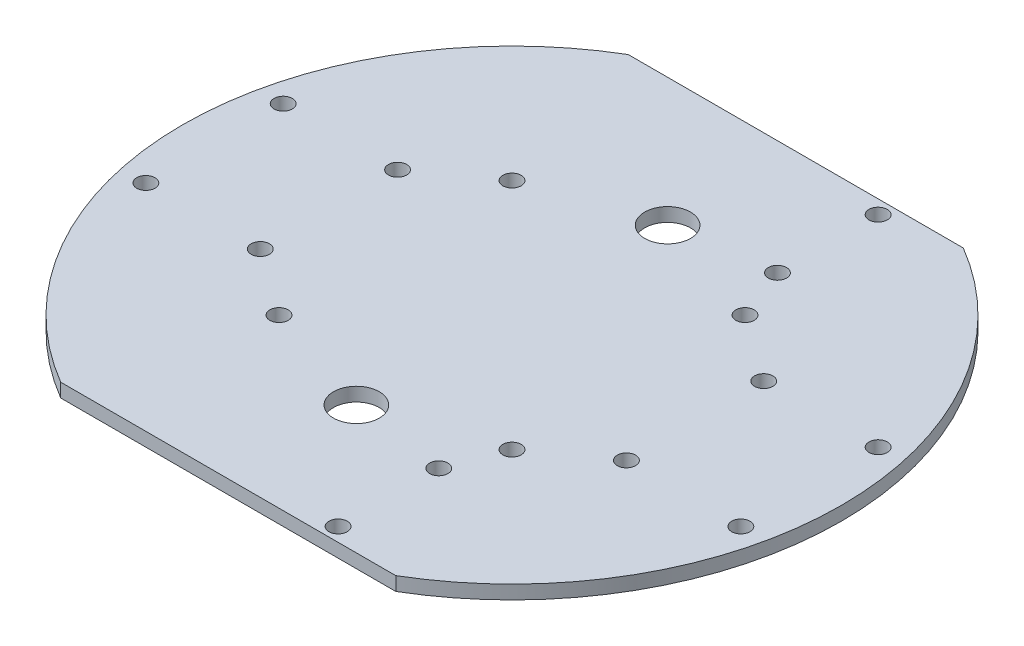
ISO-10303-21;
HEADER;
FILE_DESCRIPTION(('STEP AP214'),'2;1');
FILE_NAME('part.step','',(''),(''),'','','');
FILE_SCHEMA(('AUTOMOTIVE_DESIGN { 1 0 10303 214 1 1 1 1 }'));
ENDSEC;
DATA;
#1=APPLICATION_CONTEXT('core data for automotive mechanical design processes');
#2=APPLICATION_PROTOCOL_DEFINITION('international standard','automotive_design',2000,#1);
#3=PRODUCT_CONTEXT('',#1,'mechanical');
#4=PRODUCT('Part','Part','',(#3));
#5=PRODUCT_RELATED_PRODUCT_CATEGORY('part','',(#4));
#6=PRODUCT_DEFINITION_FORMATION('','',#4);
#7=PRODUCT_DEFINITION_CONTEXT('part definition',#1,'design');
#8=PRODUCT_DEFINITION('design','',#6,#7);
#9=PRODUCT_DEFINITION_SHAPE('','',#8);
#10=(LENGTH_UNIT() NAMED_UNIT(*) SI_UNIT(.MILLI.,.METRE.));
#11=(NAMED_UNIT(*) PLANE_ANGLE_UNIT() SI_UNIT($,.RADIAN.));
#12=(NAMED_UNIT(*) SI_UNIT($,.STERADIAN.) SOLID_ANGLE_UNIT());
#13=UNCERTAINTY_MEASURE_WITH_UNIT(LENGTH_MEASURE(1.E-05),#10,'distance_accuracy_value','');
#14=(GEOMETRIC_REPRESENTATION_CONTEXT(3) GLOBAL_UNCERTAINTY_ASSIGNED_CONTEXT((#13)) GLOBAL_UNIT_ASSIGNED_CONTEXT((#10,
#11,#12)) REPRESENTATION_CONTEXT('',''));
#15=CARTESIAN_POINT('',(0.,0.,0.));
#16=DIRECTION('',(0.,0.,1.));
#17=DIRECTION('',(1.,0.,0.));
#18=AXIS2_PLACEMENT_3D('',#15,#16,#17);
#19=CARTESIAN_POINT('',(0.,3.,0.));
#20=DIRECTION('',(0.,-1.,0.));
#21=DIRECTION('',(0.,0.,-1.));
#22=AXIS2_PLACEMENT_3D('',#19,#20,#21);
#23=CYLINDRICAL_SURFACE('',#22,72.);
#24=CARTESIAN_POINT('',(0.,0.,0.));
#25=DIRECTION('',(0.,1.,0.));
#26=DIRECTION('',(0.,0.,1.));
#27=AXIS2_PLACEMENT_3D('',#24,#25,#26);
#28=CIRCLE('',#27,72.);
#29=CARTESIAN_POINT('',(36.6060104354463,0.,62.));
#30=VERTEX_POINT('',#29);
#31=CARTESIAN_POINT('',(36.6060104354463,0.,-62.));
#32=VERTEX_POINT('',#31);
#33=EDGE_CURVE('E157',#30,#32,#28,.T.);
#34=ORIENTED_EDGE('',*,*,#33,.T.);
#35=DIRECTION('',(0.,-1.,0.));
#36=VECTOR('',#35,1.);
#37=CARTESIAN_POINT('',(36.6060104354463,3.,-62.));
#38=LINE('',#37,#36);
#39=CARTESIAN_POINT('',(36.6060104354463,3.,-62.));
#40=VERTEX_POINT('',#39);
#41=EDGE_CURVE('E11',#40,#32,#38,.T.);
#42=ORIENTED_EDGE('',*,*,#41,.F.);
#43=CARTESIAN_POINT('',(0.,3.,0.));
#44=DIRECTION('',(0.,1.,0.));
#45=DIRECTION('',(0.,0.,1.));
#46=AXIS2_PLACEMENT_3D('',#43,#44,#45);
#47=CIRCLE('',#46,72.);
#48=CARTESIAN_POINT('',(36.6060104354463,3.,62.));
#49=VERTEX_POINT('',#48);
#50=EDGE_CURVE('E79',#49,#40,#47,.T.);
#51=ORIENTED_EDGE('',*,*,#50,.F.);
#52=DIRECTION('',(0.,-1.,0.));
#53=VECTOR('',#52,1.);
#54=CARTESIAN_POINT('',(36.6060104354463,3.,62.));
#55=LINE('',#54,#53);
#56=EDGE_CURVE('E150',#49,#30,#55,.T.);
#57=ORIENTED_EDGE('',*,*,#56,.T.);
#58=EDGE_LOOP('',(#34,#42,#51,#57));
#59=FACE_BOUND('',#58,.T.);
#60=ADVANCED_FACE('F36',(#59),#23,.T.);
#61=CARTESIAN_POINT('',(0.,3.,-62.));
#62=DIRECTION('',(0.,0.,-1.));
#63=DIRECTION('',(-1.,0.,0.));
#64=AXIS2_PLACEMENT_3D('',#61,#62,#63);
#65=PLANE('',#64);
#66=DIRECTION('',(1.,0.,0.));
#67=VECTOR('',#66,1.);
#68=CARTESIAN_POINT('',(0.,0.,-62.));
#69=LINE('',#68,#67);
#70=CARTESIAN_POINT('',(-36.6060104354462,0.,-62.));
#71=VERTEX_POINT('',#70);
#72=EDGE_CURVE('E89',#71,#32,#69,.T.);
#73=ORIENTED_EDGE('',*,*,#72,.F.);
#74=DIRECTION('',(0.,-1.,0.));
#75=VECTOR('',#74,1.);
#76=CARTESIAN_POINT('',(-36.6060104354462,3.,-62.));
#77=LINE('',#76,#75);
#78=CARTESIAN_POINT('',(-36.6060104354462,3.,-62.));
#79=VERTEX_POINT('',#78);
#80=EDGE_CURVE('E45',#79,#71,#77,.T.);
#81=ORIENTED_EDGE('',*,*,#80,.F.);
#82=DIRECTION('',(1.,0.,0.));
#83=VECTOR('',#82,1.);
#84=CARTESIAN_POINT('',(0.,3.,-62.));
#85=LINE('',#84,#83);
#86=EDGE_CURVE('E87',#79,#40,#85,.T.);
#87=ORIENTED_EDGE('',*,*,#86,.T.);
#88=ORIENTED_EDGE('',*,*,#41,.T.);
#89=EDGE_LOOP('',(#73,#81,#87,#88));
#90=FACE_BOUND('',#89,.T.);
#91=ADVANCED_FACE('F86',(#90),#65,.T.);
#92=CARTESIAN_POINT('',(0.,3.,0.));
#93=DIRECTION('',(0.,-1.,0.));
#94=DIRECTION('',(0.,0.,-1.));
#95=AXIS2_PLACEMENT_3D('',#92,#93,#94);
#96=CYLINDRICAL_SURFACE('',#95,72.);
#97=CARTESIAN_POINT('',(0.,0.,0.));
#98=DIRECTION('',(0.,1.,0.));
#99=DIRECTION('',(0.,0.,1.));
#100=AXIS2_PLACEMENT_3D('',#97,#98,#99);
#101=CIRCLE('',#100,72.);
#102=CARTESIAN_POINT('',(-36.6060104354462,0.,62.));
#103=VERTEX_POINT('',#102);
#104=EDGE_CURVE('E68',#71,#103,#101,.T.);
#105=ORIENTED_EDGE('',*,*,#104,.T.);
#106=DIRECTION('',(0.,-1.,0.));
#107=VECTOR('',#106,1.);
#108=CARTESIAN_POINT('',(-36.6060104354462,3.,62.));
#109=LINE('',#108,#107);
#110=CARTESIAN_POINT('',(-36.6060104354462,3.,62.));
#111=VERTEX_POINT('',#110);
#112=EDGE_CURVE('E90',#111,#103,#109,.T.);
#113=ORIENTED_EDGE('',*,*,#112,.F.);
#114=CARTESIAN_POINT('',(0.,3.,0.));
#115=DIRECTION('',(0.,1.,0.));
#116=DIRECTION('',(0.,0.,1.));
#117=AXIS2_PLACEMENT_3D('',#114,#115,#116);
#118=CIRCLE('',#117,72.);
#119=EDGE_CURVE('E91',#79,#111,#118,.T.);
#120=ORIENTED_EDGE('',*,*,#119,.F.);
#121=ORIENTED_EDGE('',*,*,#80,.T.);
#122=EDGE_LOOP('',(#105,#113,#120,#121));
#123=FACE_BOUND('',#122,.T.);
#124=ADVANCED_FACE('F92',(#123),#96,.T.);
#125=CARTESIAN_POINT('',(40.,3.,15.));
#126=DIRECTION('',(0.,-1.,0.));
#127=DIRECTION('',(0.,0.,-1.));
#128=AXIS2_PLACEMENT_3D('',#125,#126,#127);
#129=CYLINDRICAL_SURFACE('',#128,2.);
#130=CARTESIAN_POINT('',(40.,3.,15.));
#131=DIRECTION('',(0.,1.,0.));
#132=DIRECTION('',(0.,0.,1.));
#133=AXIS2_PLACEMENT_3D('',#130,#131,#132);
#134=CIRCLE('',#133,2.);
#135=CARTESIAN_POINT('',(40.,3.,17.));
#136=VERTEX_POINT('',#135);
#137=EDGE_CURVE('E144',#136,#136,#134,.T.);
#138=ORIENTED_EDGE('',*,*,#137,.T.);
#139=EDGE_LOOP('',(#138));
#140=FACE_BOUND('',#139,.T.);
#141=CARTESIAN_POINT('',(40.,0.,15.));
#142=DIRECTION('',(0.,1.,0.));
#143=DIRECTION('',(0.,0.,1.));
#144=AXIS2_PLACEMENT_3D('',#141,#142,#143);
#145=CIRCLE('',#144,2.);
#146=CARTESIAN_POINT('',(40.,0.,17.));
#147=VERTEX_POINT('',#146);
#148=EDGE_CURVE('E205',#147,#147,#145,.T.);
#149=ORIENTED_EDGE('',*,*,#148,.F.);
#150=EDGE_LOOP('',(#149));
#151=FACE_BOUND('',#150,.T.);
#152=ADVANCED_FACE('F255',(#140,#151),#129,.F.);
#153=CARTESIAN_POINT('',(65.,3.,15.));
#154=DIRECTION('',(0.,-1.,0.));
#155=DIRECTION('',(0.,0.,-1.));
#156=AXIS2_PLACEMENT_3D('',#153,#154,#155);
#157=CYLINDRICAL_SURFACE('',#156,2.);
#158=CARTESIAN_POINT('',(65.,3.,15.));
#159=DIRECTION('',(0.,1.,0.));
#160=DIRECTION('',(0.,0.,1.));
#161=AXIS2_PLACEMENT_3D('',#158,#159,#160);
#162=CIRCLE('',#161,2.);
#163=CARTESIAN_POINT('',(65.,3.,17.));
#164=VERTEX_POINT('',#163);
#165=EDGE_CURVE('E141',#164,#164,#162,.T.);
#166=ORIENTED_EDGE('',*,*,#165,.T.);
#167=EDGE_LOOP('',(#166));
#168=FACE_BOUND('',#167,.T.);
#169=CARTESIAN_POINT('',(65.,0.,15.));
#170=DIRECTION('',(0.,1.,0.));
#171=DIRECTION('',(0.,0.,1.));
#172=AXIS2_PLACEMENT_3D('',#169,#170,#171);
#173=CIRCLE('',#172,2.);
#174=CARTESIAN_POINT('',(65.,0.,17.));
#175=VERTEX_POINT('',#174);
#176=EDGE_CURVE('E202',#175,#175,#173,.T.);
#177=ORIENTED_EDGE('',*,*,#176,.F.);
#178=EDGE_LOOP('',(#177));
#179=FACE_BOUND('',#178,.T.);
#180=ADVANCED_FACE('F258',(#168,#179),#157,.F.);
#181=CARTESIAN_POINT('',(65.,3.,-15.));
#182=DIRECTION('',(0.,-1.,0.));
#183=DIRECTION('',(0.,0.,-1.));
#184=AXIS2_PLACEMENT_3D('',#181,#182,#183);
#185=CYLINDRICAL_SURFACE('',#184,2.);
#186=CARTESIAN_POINT('',(65.,3.,-15.));
#187=DIRECTION('',(0.,1.,0.));
#188=DIRECTION('',(0.,0.,1.));
#189=AXIS2_PLACEMENT_3D('',#186,#187,#188);
#190=CIRCLE('',#189,2.);
#191=CARTESIAN_POINT('',(65.,3.,-13.));
#192=VERTEX_POINT('',#191);
#193=EDGE_CURVE('E138',#192,#192,#190,.F.);
#194=ORIENTED_EDGE('',*,*,#193,.F.);
#195=EDGE_LOOP('',(#194));
#196=FACE_BOUND('',#195,.T.);
#197=CARTESIAN_POINT('',(65.,0.,-15.));
#198=DIRECTION('',(0.,1.,0.));
#199=DIRECTION('',(0.,0.,1.));
#200=AXIS2_PLACEMENT_3D('',#197,#198,#199);
#201=CIRCLE('',#200,2.);
#202=CARTESIAN_POINT('',(65.,0.,-13.));
#203=VERTEX_POINT('',#202);
#204=EDGE_CURVE('E199',#203,#203,#201,.F.);
#205=ORIENTED_EDGE('',*,*,#204,.T.);
#206=EDGE_LOOP('',(#205));
#207=FACE_BOUND('',#206,.T.);
#208=ADVANCED_FACE('F262',(#196,#207),#185,.F.);
#209=CARTESIAN_POINT('',(25.4558441227157,3.,-25.4558441227157));
#210=DIRECTION('',(0.,-1.,0.));
#211=DIRECTION('',(0.,0.,-1.));
#212=AXIS2_PLACEMENT_3D('',#209,#210,#211);
#213=CYLINDRICAL_SURFACE('',#212,2.00000000000001);
#214=CARTESIAN_POINT('',(25.4558441227157,3.,-25.4558441227157));
#215=DIRECTION('',(0.,1.,0.));
#216=DIRECTION('',(0.,0.,1.));
#217=AXIS2_PLACEMENT_3D('',#214,#215,#216);
#218=CIRCLE('',#217,2.00000000000001);
#219=CARTESIAN_POINT('',(25.4558441227157,3.,-23.4558441227157));
#220=VERTEX_POINT('',#219);
#221=EDGE_CURVE('E135',#220,#220,#218,.T.);
#222=ORIENTED_EDGE('',*,*,#221,.T.);
#223=EDGE_LOOP('',(#222));
#224=FACE_BOUND('',#223,.T.);
#225=CARTESIAN_POINT('',(25.4558441227157,0.,-25.4558441227157));
#226=DIRECTION('',(0.,1.,0.));
#227=DIRECTION('',(0.,0.,1.));
#228=AXIS2_PLACEMENT_3D('',#225,#226,#227);
#229=CIRCLE('',#228,2.00000000000001);
#230=CARTESIAN_POINT('',(25.4558441227157,0.,-23.4558441227157));
#231=VERTEX_POINT('',#230);
#232=EDGE_CURVE('E196',#231,#231,#229,.T.);
#233=ORIENTED_EDGE('',*,*,#232,.F.);
#234=EDGE_LOOP('',(#233));
#235=FACE_BOUND('',#234,.T.);
#236=ADVANCED_FACE('F266',(#224,#235),#213,.F.);
#237=CARTESIAN_POINT('',(25.4558441227156,3.,25.4558441227158));
#238=DIRECTION('',(0.,-1.,0.));
#239=DIRECTION('',(0.,0.,-1.));
#240=AXIS2_PLACEMENT_3D('',#237,#238,#239);
#241=CYLINDRICAL_SURFACE('',#240,2.);
#242=CARTESIAN_POINT('',(25.4558441227156,3.,25.4558441227158));
#243=DIRECTION('',(0.,1.,0.));
#244=DIRECTION('',(0.,0.,1.));
#245=AXIS2_PLACEMENT_3D('',#242,#243,#244);
#246=CIRCLE('',#245,2.);
#247=CARTESIAN_POINT('',(25.4558441227156,3.,27.4558441227158));
#248=VERTEX_POINT('',#247);
#249=EDGE_CURVE('E132',#248,#248,#246,.T.);
#250=ORIENTED_EDGE('',*,*,#249,.T.);
#251=EDGE_LOOP('',(#250));
#252=FACE_BOUND('',#251,.T.);
#253=CARTESIAN_POINT('',(25.4558441227156,0.,25.4558441227158));
#254=DIRECTION('',(0.,1.,0.));
#255=DIRECTION('',(0.,0.,1.));
#256=AXIS2_PLACEMENT_3D('',#253,#254,#255);
#257=CIRCLE('',#256,2.);
#258=CARTESIAN_POINT('',(25.4558441227156,0.,27.4558441227158));
#259=VERTEX_POINT('',#258);
#260=EDGE_CURVE('E193',#259,#259,#257,.T.);
#261=ORIENTED_EDGE('',*,*,#260,.F.);
#262=EDGE_LOOP('',(#261));
#263=FACE_BOUND('',#262,.T.);
#264=ADVANCED_FACE('F270',(#252,#263),#241,.F.);
#265=CARTESIAN_POINT('',(0.,3.,-34.));
#266=DIRECTION('',(0.,-1.,0.));
#267=DIRECTION('',(0.,0.,-1.));
#268=AXIS2_PLACEMENT_3D('',#265,#266,#267);
#269=CYLINDRICAL_SURFACE('',#268,5.);
#270=CARTESIAN_POINT('',(0.,3.,-34.));
#271=DIRECTION('',(0.,1.,0.));
#272=DIRECTION('',(0.,0.,1.));
#273=AXIS2_PLACEMENT_3D('',#270,#271,#272);
#274=CIRCLE('',#273,5.);
#275=CARTESIAN_POINT('',(0.,3.,-29.));
#276=VERTEX_POINT('',#275);
#277=EDGE_CURVE('E129',#276,#276,#274,.F.);
#278=ORIENTED_EDGE('',*,*,#277,.F.);
#279=EDGE_LOOP('',(#278));
#280=FACE_BOUND('',#279,.T.);
#281=CARTESIAN_POINT('',(0.,0.,-34.));
#282=DIRECTION('',(0.,1.,0.));
#283=DIRECTION('',(0.,0.,1.));
#284=AXIS2_PLACEMENT_3D('',#281,#282,#283);
#285=CIRCLE('',#284,5.);
#286=CARTESIAN_POINT('',(0.,0.,-29.));
#287=VERTEX_POINT('',#286);
#288=EDGE_CURVE('E190',#287,#287,#285,.F.);
#289=ORIENTED_EDGE('',*,*,#288,.T.);
#290=EDGE_LOOP('',(#289));
#291=FACE_BOUND('',#290,.T.);
#292=ADVANCED_FACE('F274',(#280,#291),#269,.F.);
#293=CARTESIAN_POINT('',(0.,3.,34.));
#294=DIRECTION('',(0.,-1.,0.));
#295=DIRECTION('',(0.,0.,-1.));
#296=AXIS2_PLACEMENT_3D('',#293,#294,#295);
#297=CYLINDRICAL_SURFACE('',#296,5.);
#298=CARTESIAN_POINT('',(0.,3.,34.));
#299=DIRECTION('',(0.,1.,0.));
#300=DIRECTION('',(0.,0.,1.));
#301=AXIS2_PLACEMENT_3D('',#298,#299,#300);
#302=CIRCLE('',#301,5.);
#303=CARTESIAN_POINT('',(0.,3.,39.));
#304=VERTEX_POINT('',#303);
#305=EDGE_CURVE('E126',#304,#304,#302,.T.);
#306=ORIENTED_EDGE('',*,*,#305,.T.);
#307=EDGE_LOOP('',(#306));
#308=FACE_BOUND('',#307,.T.);
#309=CARTESIAN_POINT('',(0.,0.,34.));
#310=DIRECTION('',(0.,1.,0.));
#311=DIRECTION('',(0.,0.,1.));
#312=AXIS2_PLACEMENT_3D('',#309,#310,#311);
#313=CIRCLE('',#312,5.);
#314=CARTESIAN_POINT('',(0.,0.,39.));
#315=VERTEX_POINT('',#314);
#316=EDGE_CURVE('E187',#315,#315,#313,.T.);
#317=ORIENTED_EDGE('',*,*,#316,.F.);
#318=EDGE_LOOP('',(#317));
#319=FACE_BOUND('',#318,.T.);
#320=ADVANCED_FACE('F278',(#308,#319),#297,.F.);
#321=CARTESIAN_POINT('',(-25.4558441227157,3.,-25.4558441227143));
#322=DIRECTION('',(0.,-1.,0.));
#323=DIRECTION('',(0.,0.,-1.));
#324=AXIS2_PLACEMENT_3D('',#321,#322,#323);
#325=CYLINDRICAL_SURFACE('',#324,2.00000000000153);
#326=CARTESIAN_POINT('',(-25.4558441227157,3.,-25.4558441227143));
#327=DIRECTION('',(0.,1.,0.));
#328=DIRECTION('',(0.,0.,1.));
#329=AXIS2_PLACEMENT_3D('',#326,#327,#328);
#330=CIRCLE('',#329,2.00000000000153);
#331=CARTESIAN_POINT('',(-25.4558441227157,3.,-23.4558441227128));
#332=VERTEX_POINT('',#331);
#333=EDGE_CURVE('E123',#332,#332,#330,.T.);
#334=ORIENTED_EDGE('',*,*,#333,.T.);
#335=EDGE_LOOP('',(#334));
#336=FACE_BOUND('',#335,.T.);
#337=CARTESIAN_POINT('',(-25.4558441227157,0.,-25.4558441227143));
#338=DIRECTION('',(0.,1.,0.));
#339=DIRECTION('',(0.,0.,1.));
#340=AXIS2_PLACEMENT_3D('',#337,#338,#339);
#341=CIRCLE('',#340,2.00000000000153);
#342=CARTESIAN_POINT('',(-25.4558441227157,0.,-23.4558441227128));
#343=VERTEX_POINT('',#342);
#344=EDGE_CURVE('E184',#343,#343,#341,.T.);
#345=ORIENTED_EDGE('',*,*,#344,.F.);
#346=EDGE_LOOP('',(#345));
#347=FACE_BOUND('',#346,.T.);
#348=ADVANCED_FACE('F282',(#336,#347),#325,.F.);
#349=CARTESIAN_POINT('',(-25.4558441227143,3.,25.4558441227171));
#350=DIRECTION('',(0.,-1.,0.));
#351=DIRECTION('',(0.,0.,-1.));
#352=AXIS2_PLACEMENT_3D('',#349,#350,#351);
#353=CYLINDRICAL_SURFACE('',#352,2.00000000000105);
#354=CARTESIAN_POINT('',(-25.4558441227143,3.,25.4558441227171));
#355=DIRECTION('',(0.,1.,0.));
#356=DIRECTION('',(0.,0.,1.));
#357=AXIS2_PLACEMENT_3D('',#354,#355,#356);
#358=CIRCLE('',#357,2.00000000000105);
#359=CARTESIAN_POINT('',(-25.4558441227143,3.,27.4558441227182));
#360=VERTEX_POINT('',#359);
#361=EDGE_CURVE('E120',#360,#360,#358,.T.);
#362=ORIENTED_EDGE('',*,*,#361,.T.);
#363=EDGE_LOOP('',(#362));
#364=FACE_BOUND('',#363,.T.);
#365=CARTESIAN_POINT('',(-25.4558441227143,0.,25.4558441227171));
#366=DIRECTION('',(0.,1.,0.));
#367=DIRECTION('',(0.,0.,1.));
#368=AXIS2_PLACEMENT_3D('',#365,#366,#367);
#369=CIRCLE('',#368,2.00000000000105);
#370=CARTESIAN_POINT('',(-25.4558441227143,0.,27.4558441227182));
#371=VERTEX_POINT('',#370);
#372=EDGE_CURVE('E181',#371,#371,#369,.T.);
#373=ORIENTED_EDGE('',*,*,#372,.F.);
#374=EDGE_LOOP('',(#373));
#375=FACE_BOUND('',#374,.T.);
#376=ADVANCED_FACE('F286',(#364,#375),#353,.F.);
#377=CARTESIAN_POINT('',(-40.,3.,15.));
#378=DIRECTION('',(0.,-1.,0.));
#379=DIRECTION('',(0.,0.,-1.));
#380=AXIS2_PLACEMENT_3D('',#377,#378,#379);
#381=CYLINDRICAL_SURFACE('',#380,2.);
#382=CARTESIAN_POINT('',(-40.,3.,15.));
#383=DIRECTION('',(0.,1.,0.));
#384=DIRECTION('',(0.,0.,1.));
#385=AXIS2_PLACEMENT_3D('',#382,#383,#384);
#386=CIRCLE('',#385,2.);
#387=CARTESIAN_POINT('',(-40.,3.,17.));
#388=VERTEX_POINT('',#387);
#389=EDGE_CURVE('E117',#388,#388,#386,.F.);
#390=ORIENTED_EDGE('',*,*,#389,.F.);
#391=EDGE_LOOP('',(#390));
#392=FACE_BOUND('',#391,.T.);
#393=CARTESIAN_POINT('',(-40.,0.,15.));
#394=DIRECTION('',(0.,1.,0.));
#395=DIRECTION('',(0.,0.,1.));
#396=AXIS2_PLACEMENT_3D('',#393,#394,#395);
#397=CIRCLE('',#396,2.);
#398=CARTESIAN_POINT('',(-40.,0.,17.));
#399=VERTEX_POINT('',#398);
#400=EDGE_CURVE('E178',#399,#399,#397,.F.);
#401=ORIENTED_EDGE('',*,*,#400,.T.);
#402=EDGE_LOOP('',(#401));
#403=FACE_BOUND('',#402,.T.);
#404=ADVANCED_FACE('F290',(#392,#403),#381,.F.);
#405=CARTESIAN_POINT('',(-40.,3.,-15.));
#406=DIRECTION('',(0.,-1.,0.));
#407=DIRECTION('',(0.,0.,-1.));
#408=AXIS2_PLACEMENT_3D('',#405,#406,#407);
#409=CYLINDRICAL_SURFACE('',#408,2.);
#410=CARTESIAN_POINT('',(-40.,3.,-15.));
#411=DIRECTION('',(0.,1.,0.));
#412=DIRECTION('',(0.,0.,1.));
#413=AXIS2_PLACEMENT_3D('',#410,#411,#412);
#414=CIRCLE('',#413,2.);
#415=CARTESIAN_POINT('',(-40.,3.,-13.));
#416=VERTEX_POINT('',#415);
#417=EDGE_CURVE('E114',#416,#416,#414,.T.);
#418=ORIENTED_EDGE('',*,*,#417,.T.);
#419=EDGE_LOOP('',(#418));
#420=FACE_BOUND('',#419,.T.);
#421=CARTESIAN_POINT('',(-40.,0.,-15.));
#422=DIRECTION('',(0.,1.,0.));
#423=DIRECTION('',(0.,0.,1.));
#424=AXIS2_PLACEMENT_3D('',#421,#422,#423);
#425=CIRCLE('',#424,2.);
#426=CARTESIAN_POINT('',(-40.,0.,-13.));
#427=VERTEX_POINT('',#426);
#428=EDGE_CURVE('E175',#427,#427,#425,.T.);
#429=ORIENTED_EDGE('',*,*,#428,.F.);
#430=EDGE_LOOP('',(#429));
#431=FACE_BOUND('',#430,.T.);
#432=ADVANCED_FACE('F294',(#420,#431),#409,.F.);
#433=CARTESIAN_POINT('',(-65.,3.,-15.));
#434=DIRECTION('',(0.,-1.,0.));
#435=DIRECTION('',(0.,0.,-1.));
#436=AXIS2_PLACEMENT_3D('',#433,#434,#435);
#437=CYLINDRICAL_SURFACE('',#436,2.);
#438=CARTESIAN_POINT('',(-65.,3.,-15.));
#439=DIRECTION('',(0.,1.,0.));
#440=DIRECTION('',(0.,0.,1.));
#441=AXIS2_PLACEMENT_3D('',#438,#439,#440);
#442=CIRCLE('',#441,2.);
#443=CARTESIAN_POINT('',(-65.,3.,-13.));
#444=VERTEX_POINT('',#443);
#445=EDGE_CURVE('E111',#444,#444,#442,.T.);
#446=ORIENTED_EDGE('',*,*,#445,.T.);
#447=EDGE_LOOP('',(#446));
#448=FACE_BOUND('',#447,.T.);
#449=CARTESIAN_POINT('',(-65.,0.,-15.));
#450=DIRECTION('',(0.,1.,0.));
#451=DIRECTION('',(0.,0.,1.));
#452=AXIS2_PLACEMENT_3D('',#449,#450,#451);
#453=CIRCLE('',#452,2.);
#454=CARTESIAN_POINT('',(-65.,0.,-13.));
#455=VERTEX_POINT('',#454);
#456=EDGE_CURVE('E172',#455,#455,#453,.T.);
#457=ORIENTED_EDGE('',*,*,#456,.F.);
#458=EDGE_LOOP('',(#457));
#459=FACE_BOUND('',#458,.T.);
#460=ADVANCED_FACE('F298',(#448,#459),#437,.F.);
#461=CARTESIAN_POINT('',(-65.,3.,15.));
#462=DIRECTION('',(0.,-1.,0.));
#463=DIRECTION('',(0.,0.,-1.));
#464=AXIS2_PLACEMENT_3D('',#461,#462,#463);
#465=CYLINDRICAL_SURFACE('',#464,2.);
#466=CARTESIAN_POINT('',(-65.,3.,15.));
#467=DIRECTION('',(0.,1.,0.));
#468=DIRECTION('',(0.,0.,1.));
#469=AXIS2_PLACEMENT_3D('',#466,#467,#468);
#470=CIRCLE('',#469,2.);
#471=CARTESIAN_POINT('',(-65.,3.,17.));
#472=VERTEX_POINT('',#471);
#473=EDGE_CURVE('E108',#472,#472,#470,.F.);
#474=ORIENTED_EDGE('',*,*,#473,.F.);
#475=EDGE_LOOP('',(#474));
#476=FACE_BOUND('',#475,.T.);
#477=CARTESIAN_POINT('',(-65.,0.,15.));
#478=DIRECTION('',(0.,1.,0.));
#479=DIRECTION('',(0.,0.,1.));
#480=AXIS2_PLACEMENT_3D('',#477,#478,#479);
#481=CIRCLE('',#480,2.);
#482=CARTESIAN_POINT('',(-65.,0.,17.));
#483=VERTEX_POINT('',#482);
#484=EDGE_CURVE('E169',#483,#483,#481,.F.);
#485=ORIENTED_EDGE('',*,*,#484,.T.);
#486=EDGE_LOOP('',(#485));
#487=FACE_BOUND('',#486,.T.);
#488=ADVANCED_FACE('F302',(#476,#487),#465,.F.);
#489=CARTESIAN_POINT('',(21.,3.,37.));
#490=DIRECTION('',(0.,-1.,0.));
#491=DIRECTION('',(0.,0.,-1.));
#492=AXIS2_PLACEMENT_3D('',#489,#490,#491);
#493=CYLINDRICAL_SURFACE('',#492,2.00000000000001);
#494=CARTESIAN_POINT('',(21.,3.,37.));
#495=DIRECTION('',(0.,1.,0.));
#496=DIRECTION('',(0.,0.,1.));
#497=AXIS2_PLACEMENT_3D('',#494,#495,#496);
#498=CIRCLE('',#497,2.00000000000001);
#499=CARTESIAN_POINT('',(21.,3.,39.));
#500=VERTEX_POINT('',#499);
#501=EDGE_CURVE('E105',#500,#500,#498,.T.);
#502=ORIENTED_EDGE('',*,*,#501,.T.);
#503=EDGE_LOOP('',(#502));
#504=FACE_BOUND('',#503,.T.);
#505=CARTESIAN_POINT('',(21.,0.,37.));
#506=DIRECTION('',(0.,1.,0.));
#507=DIRECTION('',(0.,0.,1.));
#508=AXIS2_PLACEMENT_3D('',#505,#506,#507);
#509=CIRCLE('',#508,2.00000000000001);
#510=CARTESIAN_POINT('',(21.,0.,39.));
#511=VERTEX_POINT('',#510);
#512=EDGE_CURVE('E166',#511,#511,#509,.T.);
#513=ORIENTED_EDGE('',*,*,#512,.F.);
#514=EDGE_LOOP('',(#513));
#515=FACE_BOUND('',#514,.T.);
#516=ADVANCED_FACE('F306',(#504,#515),#493,.F.);
#517=CARTESIAN_POINT('',(21.,3.,59.));
#518=DIRECTION('',(0.,-1.,0.));
#519=DIRECTION('',(0.,0.,-1.));
#520=AXIS2_PLACEMENT_3D('',#517,#518,#519);
#521=CYLINDRICAL_SURFACE('',#520,2.);
#522=CARTESIAN_POINT('',(21.,3.,59.));
#523=DIRECTION('',(0.,1.,0.));
#524=DIRECTION('',(0.,0.,1.));
#525=AXIS2_PLACEMENT_3D('',#522,#523,#524);
#526=CIRCLE('',#525,2.);
#527=CARTESIAN_POINT('',(21.,3.,61.));
#528=VERTEX_POINT('',#527);
#529=EDGE_CURVE('E102',#528,#528,#526,.T.);
#530=ORIENTED_EDGE('',*,*,#529,.T.);
#531=EDGE_LOOP('',(#530));
#532=FACE_BOUND('',#531,.T.);
#533=CARTESIAN_POINT('',(21.,0.,59.));
#534=DIRECTION('',(0.,1.,0.));
#535=DIRECTION('',(0.,0.,1.));
#536=AXIS2_PLACEMENT_3D('',#533,#534,#535);
#537=CIRCLE('',#536,2.);
#538=CARTESIAN_POINT('',(21.,0.,61.));
#539=VERTEX_POINT('',#538);
#540=EDGE_CURVE('E163',#539,#539,#537,.T.);
#541=ORIENTED_EDGE('',*,*,#540,.F.);
#542=EDGE_LOOP('',(#541));
#543=FACE_BOUND('',#542,.T.);
#544=ADVANCED_FACE('F235',(#532,#543),#521,.F.);
#545=CARTESIAN_POINT('',(0.,3.,62.));
#546=DIRECTION('',(0.,0.,-1.));
#547=DIRECTION('',(-1.,0.,0.));
#548=AXIS2_PLACEMENT_3D('',#545,#546,#547);
#549=PLANE('',#548);
#550=DIRECTION('',(1.,0.,0.));
#551=VECTOR('',#550,1.);
#552=CARTESIAN_POINT('',(0.,0.,62.));
#553=LINE('',#552,#551);
#554=EDGE_CURVE('E74',#103,#30,#553,.T.);
#555=ORIENTED_EDGE('',*,*,#554,.T.);
#556=ORIENTED_EDGE('',*,*,#56,.F.);
#557=DIRECTION('',(1.,0.,0.));
#558=VECTOR('',#557,1.);
#559=CARTESIAN_POINT('',(0.,3.,62.));
#560=LINE('',#559,#558);
#561=EDGE_CURVE('E53',#111,#49,#560,.T.);
#562=ORIENTED_EDGE('',*,*,#561,.F.);
#563=ORIENTED_EDGE('',*,*,#112,.T.);
#564=EDGE_LOOP('',(#555,#556,#562,#563));
#565=FACE_BOUND('',#564,.T.);
#566=ADVANCED_FACE('F213',(#565),#549,.F.);
#567=CARTESIAN_POINT('',(21.,3.,-59.));
#568=DIRECTION('',(0.,-1.,0.));
#569=DIRECTION('',(0.,0.,-1.));
#570=AXIS2_PLACEMENT_3D('',#567,#568,#569);
#571=CYLINDRICAL_SURFACE('',#570,2.);
#572=CARTESIAN_POINT('',(21.,3.,-59.));
#573=DIRECTION('',(0.,1.,0.));
#574=DIRECTION('',(0.,0.,1.));
#575=AXIS2_PLACEMENT_3D('',#572,#573,#574);
#576=CIRCLE('',#575,2.);
#577=CARTESIAN_POINT('',(21.,3.,-57.));
#578=VERTEX_POINT('',#577);
#579=EDGE_CURVE('E97',#578,#578,#576,.F.);
#580=ORIENTED_EDGE('',*,*,#579,.F.);
#581=EDGE_LOOP('',(#580));
#582=FACE_BOUND('',#581,.T.);
#583=CARTESIAN_POINT('',(21.,0.,-59.));
#584=DIRECTION('',(0.,1.,0.));
#585=DIRECTION('',(0.,0.,1.));
#586=AXIS2_PLACEMENT_3D('',#583,#584,#585);
#587=CIRCLE('',#586,2.);
#588=CARTESIAN_POINT('',(21.,0.,-57.));
#589=VERTEX_POINT('',#588);
#590=EDGE_CURVE('E154',#589,#589,#587,.F.);
#591=ORIENTED_EDGE('',*,*,#590,.T.);
#592=EDGE_LOOP('',(#591));
#593=FACE_BOUND('',#592,.T.);
#594=ADVANCED_FACE('F226',(#582,#593),#571,.F.);
#595=CARTESIAN_POINT('',(21.,3.,-37.));
#596=DIRECTION('',(0.,-1.,0.));
#597=DIRECTION('',(0.,0.,-1.));
#598=AXIS2_PLACEMENT_3D('',#595,#596,#597);
#599=CYLINDRICAL_SURFACE('',#598,2.00000000000001);
#600=CARTESIAN_POINT('',(21.,3.,-37.));
#601=DIRECTION('',(0.,1.,0.));
#602=DIRECTION('',(0.,0.,1.));
#603=AXIS2_PLACEMENT_3D('',#600,#601,#602);
#604=CIRCLE('',#603,2.00000000000001);
#605=CARTESIAN_POINT('',(21.,3.,-35.));
#606=VERTEX_POINT('',#605);
#607=EDGE_CURVE('E211',#606,#606,#604,.F.);
#608=ORIENTED_EDGE('',*,*,#607,.F.);
#609=EDGE_LOOP('',(#608));
#610=FACE_BOUND('',#609,.T.);
#611=CARTESIAN_POINT('',(21.,0.,-37.));
#612=DIRECTION('',(0.,1.,0.));
#613=DIRECTION('',(0.,0.,1.));
#614=AXIS2_PLACEMENT_3D('',#611,#612,#613);
#615=CIRCLE('',#614,2.00000000000001);
#616=CARTESIAN_POINT('',(21.,0.,-35.));
#617=VERTEX_POINT('',#616);
#618=EDGE_CURVE('E151',#617,#617,#615,.F.);
#619=ORIENTED_EDGE('',*,*,#618,.T.);
#620=EDGE_LOOP('',(#619));
#621=FACE_BOUND('',#620,.T.);
#622=ADVANCED_FACE('F38',(#610,#621),#599,.F.);
#623=CARTESIAN_POINT('',(40.,3.,-15.));
#624=DIRECTION('',(0.,-1.,0.));
#625=DIRECTION('',(0.,0.,-1.));
#626=AXIS2_PLACEMENT_3D('',#623,#624,#625);
#627=CYLINDRICAL_SURFACE('',#626,2.);
#628=CARTESIAN_POINT('',(40.,3.,-15.));
#629=DIRECTION('',(0.,1.,0.));
#630=DIRECTION('',(0.,0.,1.));
#631=AXIS2_PLACEMENT_3D('',#628,#629,#630);
#632=CIRCLE('',#631,2.);
#633=CARTESIAN_POINT('',(40.,3.,-13.));
#634=VERTEX_POINT('',#633);
#635=EDGE_CURVE('E147',#634,#634,#632,.F.);
#636=ORIENTED_EDGE('',*,*,#635,.F.);
#637=EDGE_LOOP('',(#636));
#638=FACE_BOUND('',#637,.T.);
#639=CARTESIAN_POINT('',(40.,0.,-15.));
#640=DIRECTION('',(0.,1.,0.));
#641=DIRECTION('',(0.,0.,1.));
#642=AXIS2_PLACEMENT_3D('',#639,#640,#641);
#643=CIRCLE('',#642,2.);
#644=CARTESIAN_POINT('',(40.,0.,-13.));
#645=VERTEX_POINT('',#644);
#646=EDGE_CURVE('E208',#645,#645,#643,.F.);
#647=ORIENTED_EDGE('',*,*,#646,.T.);
#648=EDGE_LOOP('',(#647));
#649=FACE_BOUND('',#648,.T.);
#650=ADVANCED_FACE('F233',(#638,#649),#627,.F.);
#651=CARTESIAN_POINT('',(0.,3.,0.));
#652=DIRECTION('',(0.,1.,0.));
#653=DIRECTION('',(0.,0.,1.));
#654=AXIS2_PLACEMENT_3D('',#651,#652,#653);
#655=PLANE('',#654);
#656=ORIENTED_EDGE('',*,*,#607,.T.);
#657=EDGE_LOOP('',(#656));
#658=FACE_BOUND('',#657,.T.);
#659=ORIENTED_EDGE('',*,*,#579,.T.);
#660=EDGE_LOOP('',(#659));
#661=FACE_BOUND('',#660,.T.);
#662=ORIENTED_EDGE('',*,*,#50,.T.);
#663=ORIENTED_EDGE('',*,*,#86,.F.);
#664=ORIENTED_EDGE('',*,*,#119,.T.);
#665=ORIENTED_EDGE('',*,*,#561,.T.);
#666=EDGE_LOOP('',(#662,#663,#664,#665));
#667=FACE_BOUND('',#666,.T.);
#668=ORIENTED_EDGE('',*,*,#529,.F.);
#669=EDGE_LOOP('',(#668));
#670=FACE_BOUND('',#669,.T.);
#671=ORIENTED_EDGE('',*,*,#501,.F.);
#672=EDGE_LOOP('',(#671));
#673=FACE_BOUND('',#672,.T.);
#674=ORIENTED_EDGE('',*,*,#473,.T.);
#675=EDGE_LOOP('',(#674));
#676=FACE_BOUND('',#675,.T.);
#677=ORIENTED_EDGE('',*,*,#445,.F.);
#678=EDGE_LOOP('',(#677));
#679=FACE_BOUND('',#678,.T.);
#680=ORIENTED_EDGE('',*,*,#417,.F.);
#681=EDGE_LOOP('',(#680));
#682=FACE_BOUND('',#681,.T.);
#683=ORIENTED_EDGE('',*,*,#389,.T.);
#684=EDGE_LOOP('',(#683));
#685=FACE_BOUND('',#684,.T.);
#686=ORIENTED_EDGE('',*,*,#361,.F.);
#687=EDGE_LOOP('',(#686));
#688=FACE_BOUND('',#687,.T.);
#689=ORIENTED_EDGE('',*,*,#333,.F.);
#690=EDGE_LOOP('',(#689));
#691=FACE_BOUND('',#690,.T.);
#692=ORIENTED_EDGE('',*,*,#305,.F.);
#693=EDGE_LOOP('',(#692));
#694=FACE_BOUND('',#693,.T.);
#695=ORIENTED_EDGE('',*,*,#277,.T.);
#696=EDGE_LOOP('',(#695));
#697=FACE_BOUND('',#696,.T.);
#698=ORIENTED_EDGE('',*,*,#249,.F.);
#699=EDGE_LOOP('',(#698));
#700=FACE_BOUND('',#699,.T.);
#701=ORIENTED_EDGE('',*,*,#221,.F.);
#702=EDGE_LOOP('',(#701));
#703=FACE_BOUND('',#702,.T.);
#704=ORIENTED_EDGE('',*,*,#193,.T.);
#705=EDGE_LOOP('',(#704));
#706=FACE_BOUND('',#705,.T.);
#707=ORIENTED_EDGE('',*,*,#165,.F.);
#708=EDGE_LOOP('',(#707));
#709=FACE_BOUND('',#708,.T.);
#710=ORIENTED_EDGE('',*,*,#137,.F.);
#711=EDGE_LOOP('',(#710));
#712=FACE_BOUND('',#711,.T.);
#713=ORIENTED_EDGE('',*,*,#635,.T.);
#714=EDGE_LOOP('',(#713));
#715=FACE_BOUND('',#714,.T.);
#716=ADVANCED_FACE('F94',(#658,#661,#667,#670,#673,#676,#679,#682,#685,#688,#691,#694,#697,#700,
#703,#706,#709,#712,#715),#655,.T.);
#717=CARTESIAN_POINT('',(0.,0.,0.));
#718=DIRECTION('',(0.,1.,0.));
#719=DIRECTION('',(0.,0.,1.));
#720=AXIS2_PLACEMENT_3D('',#717,#718,#719);
#721=PLANE('',#720);
#722=ORIENTED_EDGE('',*,*,#618,.F.);
#723=EDGE_LOOP('',(#722));
#724=FACE_BOUND('',#723,.T.);
#725=ORIENTED_EDGE('',*,*,#590,.F.);
#726=EDGE_LOOP('',(#725));
#727=FACE_BOUND('',#726,.T.);
#728=ORIENTED_EDGE('',*,*,#33,.F.);
#729=ORIENTED_EDGE('',*,*,#554,.F.);
#730=ORIENTED_EDGE('',*,*,#104,.F.);
#731=ORIENTED_EDGE('',*,*,#72,.T.);
#732=EDGE_LOOP('',(#728,#729,#730,#731));
#733=FACE_BOUND('',#732,.T.);
#734=ORIENTED_EDGE('',*,*,#540,.T.);
#735=EDGE_LOOP('',(#734));
#736=FACE_BOUND('',#735,.T.);
#737=ORIENTED_EDGE('',*,*,#512,.T.);
#738=EDGE_LOOP('',(#737));
#739=FACE_BOUND('',#738,.T.);
#740=ORIENTED_EDGE('',*,*,#484,.F.);
#741=EDGE_LOOP('',(#740));
#742=FACE_BOUND('',#741,.T.);
#743=ORIENTED_EDGE('',*,*,#456,.T.);
#744=EDGE_LOOP('',(#743));
#745=FACE_BOUND('',#744,.T.);
#746=ORIENTED_EDGE('',*,*,#428,.T.);
#747=EDGE_LOOP('',(#746));
#748=FACE_BOUND('',#747,.T.);
#749=ORIENTED_EDGE('',*,*,#400,.F.);
#750=EDGE_LOOP('',(#749));
#751=FACE_BOUND('',#750,.T.);
#752=ORIENTED_EDGE('',*,*,#372,.T.);
#753=EDGE_LOOP('',(#752));
#754=FACE_BOUND('',#753,.T.);
#755=ORIENTED_EDGE('',*,*,#344,.T.);
#756=EDGE_LOOP('',(#755));
#757=FACE_BOUND('',#756,.T.);
#758=ORIENTED_EDGE('',*,*,#316,.T.);
#759=EDGE_LOOP('',(#758));
#760=FACE_BOUND('',#759,.T.);
#761=ORIENTED_EDGE('',*,*,#288,.F.);
#762=EDGE_LOOP('',(#761));
#763=FACE_BOUND('',#762,.T.);
#764=ORIENTED_EDGE('',*,*,#260,.T.);
#765=EDGE_LOOP('',(#764));
#766=FACE_BOUND('',#765,.T.);
#767=ORIENTED_EDGE('',*,*,#232,.T.);
#768=EDGE_LOOP('',(#767));
#769=FACE_BOUND('',#768,.T.);
#770=ORIENTED_EDGE('',*,*,#204,.F.);
#771=EDGE_LOOP('',(#770));
#772=FACE_BOUND('',#771,.T.);
#773=ORIENTED_EDGE('',*,*,#176,.T.);
#774=EDGE_LOOP('',(#773));
#775=FACE_BOUND('',#774,.T.);
#776=ORIENTED_EDGE('',*,*,#148,.T.);
#777=EDGE_LOOP('',(#776));
#778=FACE_BOUND('',#777,.T.);
#779=ORIENTED_EDGE('',*,*,#646,.F.);
#780=EDGE_LOOP('',(#779));
#781=FACE_BOUND('',#780,.T.);
#782=ADVANCED_FACE('F216',(#724,#727,#733,#736,#739,#742,#745,#748,#751,#754,#757,#760,#763,
#766,#769,#772,#775,#778,#781),#721,.F.);
#783=CLOSED_SHELL('',(#60,#91,#124,#152,#180,#208,#236,#264,#292,#320,#348,#376,#404,#432,#460,
#488,#516,#544,#566,#594,#622,#650,#716,#782));
#784=MANIFOLD_SOLID_BREP('B2',#783);
#785=ADVANCED_BREP_SHAPE_REPRESENTATION('',(#18,#784),#14);
#786=SHAPE_DEFINITION_REPRESENTATION(#9,#785);
ENDSEC;
END-ISO-10303-21;
